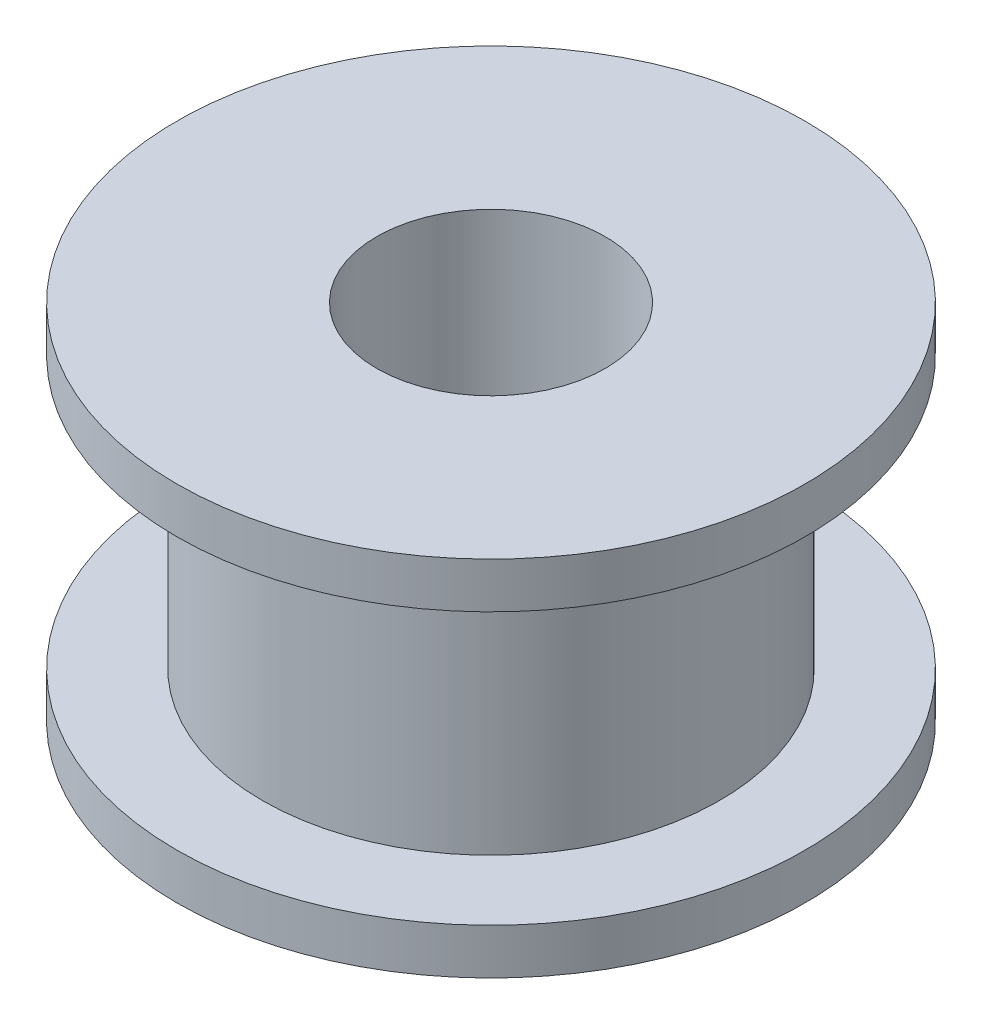
ISO-10303-21;
HEADER;
FILE_DESCRIPTION(('STEP AP214'),'2;1');
FILE_NAME('part.step','',(''),(''),'','','');
FILE_SCHEMA(('AUTOMOTIVE_DESIGN { 1 0 10303 214 1 1 1 1 }'));
ENDSEC;
DATA;
#1=APPLICATION_CONTEXT('core data for automotive mechanical design processes');
#2=APPLICATION_PROTOCOL_DEFINITION('international standard','automotive_design',2000,#1);
#3=PRODUCT_CONTEXT('',#1,'mechanical');
#4=PRODUCT('Part','Part','',(#3));
#5=PRODUCT_RELATED_PRODUCT_CATEGORY('part','',(#4));
#6=PRODUCT_DEFINITION_FORMATION('','',#4);
#7=PRODUCT_DEFINITION_CONTEXT('part definition',#1,'design');
#8=PRODUCT_DEFINITION('design','',#6,#7);
#9=PRODUCT_DEFINITION_SHAPE('','',#8);
#10=(LENGTH_UNIT() NAMED_UNIT(*) SI_UNIT(.MILLI.,.METRE.));
#11=(NAMED_UNIT(*) PLANE_ANGLE_UNIT() SI_UNIT($,.RADIAN.));
#12=(NAMED_UNIT(*) SI_UNIT($,.STERADIAN.) SOLID_ANGLE_UNIT());
#13=UNCERTAINTY_MEASURE_WITH_UNIT(LENGTH_MEASURE(1.E-05),#10,'distance_accuracy_value','');
#14=(GEOMETRIC_REPRESENTATION_CONTEXT(3) GLOBAL_UNCERTAINTY_ASSIGNED_CONTEXT((#13)) GLOBAL_UNIT_ASSIGNED_CONTEXT((#10,
#11,#12)) REPRESENTATION_CONTEXT('',''));
#15=CARTESIAN_POINT('',(0.,0.,0.));
#16=DIRECTION('',(0.,0.,1.));
#17=DIRECTION('',(1.,0.,0.));
#18=AXIS2_PLACEMENT_3D('',#15,#16,#17);
#19=CARTESIAN_POINT('',(0.,1.6,0.));
#20=DIRECTION('',(0.,-1.,0.));
#21=DIRECTION('',(0.,0.,-1.));
#22=AXIS2_PLACEMENT_3D('',#19,#20,#21);
#23=CYLINDRICAL_SURFACE('',#22,11.);
#24=CARTESIAN_POINT('',(0.,1.6,0.));
#25=DIRECTION('',(0.,1.,0.));
#26=DIRECTION('',(0.,0.,1.));
#27=AXIS2_PLACEMENT_3D('',#24,#25,#26);
#28=CIRCLE('',#27,11.);
#29=CARTESIAN_POINT('',(0.,1.6,11.));
#30=VERTEX_POINT('',#29);
#31=EDGE_CURVE('E44',#30,#30,#28,.T.);
#32=ORIENTED_EDGE('',*,*,#31,.F.);
#33=EDGE_LOOP('',(#32));
#34=FACE_BOUND('',#33,.T.);
#35=CARTESIAN_POINT('',(0.,0.,0.));
#36=DIRECTION('',(0.,1.,0.));
#37=DIRECTION('',(0.,0.,1.));
#38=AXIS2_PLACEMENT_3D('',#35,#36,#37);
#39=CIRCLE('',#38,11.);
#40=CARTESIAN_POINT('',(0.,0.,11.));
#41=VERTEX_POINT('',#40);
#42=EDGE_CURVE('E49',#41,#41,#39,.T.);
#43=ORIENTED_EDGE('',*,*,#42,.T.);
#44=EDGE_LOOP('',(#43));
#45=FACE_BOUND('',#44,.T.);
#46=ADVANCED_FACE('F37',(#34,#45),#23,.T.);
#47=CARTESIAN_POINT('',(0.,1.6,0.));
#48=DIRECTION('',(0.,1.,0.));
#49=DIRECTION('',(0.,0.,1.));
#50=AXIS2_PLACEMENT_3D('',#47,#48,#49);
#51=PLANE('',#50);
#52=CARTESIAN_POINT('',(0.,1.6,0.));
#53=DIRECTION('',(0.,1.,0.));
#54=DIRECTION('',(0.,0.,1.));
#55=AXIS2_PLACEMENT_3D('',#52,#53,#54);
#56=CIRCLE('',#55,8.);
#57=CARTESIAN_POINT('',(0.,1.6,8.));
#58=VERTEX_POINT('',#57);
#59=EDGE_CURVE('E10',#58,#58,#56,.T.);
#60=ORIENTED_EDGE('',*,*,#59,.F.);
#61=EDGE_LOOP('',(#60));
#62=FACE_BOUND('',#61,.T.);
#63=ORIENTED_EDGE('',*,*,#31,.T.);
#64=EDGE_LOOP('',(#63));
#65=FACE_BOUND('',#64,.T.);
#66=ADVANCED_FACE('F95',(#62,#65),#51,.T.);
#67=CARTESIAN_POINT('',(0.,0.,0.));
#68=DIRECTION('',(0.,1.,0.));
#69=DIRECTION('',(0.,0.,1.));
#70=AXIS2_PLACEMENT_3D('',#67,#68,#69);
#71=PLANE('',#70);
#72=CARTESIAN_POINT('',(0.,0.,0.));
#73=DIRECTION('',(0.,1.,0.));
#74=DIRECTION('',(0.,0.,1.));
#75=AXIS2_PLACEMENT_3D('',#72,#73,#74);
#76=CIRCLE('',#75,4.);
#77=CARTESIAN_POINT('',(0.,0.,4.));
#78=VERTEX_POINT('',#77);
#79=EDGE_CURVE('E68',#78,#78,#76,.T.);
#80=ORIENTED_EDGE('',*,*,#79,.T.);
#81=EDGE_LOOP('',(#80));
#82=FACE_BOUND('',#81,.T.);
#83=ORIENTED_EDGE('',*,*,#42,.F.);
#84=EDGE_LOOP('',(#83));
#85=FACE_BOUND('',#84,.T.);
#86=ADVANCED_FACE('F100',(#82,#85),#71,.F.);
#87=CARTESIAN_POINT('',(0.,11.1,0.));
#88=DIRECTION('',(0.,-1.,0.));
#89=DIRECTION('',(0.,0.,-1.));
#90=AXIS2_PLACEMENT_3D('',#87,#88,#89);
#91=CYLINDRICAL_SURFACE('',#90,8.);
#92=CARTESIAN_POINT('',(0.,11.1,0.));
#93=DIRECTION('',(0.,1.,0.));
#94=DIRECTION('',(0.,0.,1.));
#95=AXIS2_PLACEMENT_3D('',#92,#93,#94);
#96=CIRCLE('',#95,8.);
#97=CARTESIAN_POINT('',(0.,11.1,8.));
#98=VERTEX_POINT('',#97);
#99=EDGE_CURVE('E52',#98,#98,#96,.T.);
#100=ORIENTED_EDGE('',*,*,#99,.F.);
#101=EDGE_LOOP('',(#100));
#102=FACE_BOUND('',#101,.T.);
#103=ORIENTED_EDGE('',*,*,#59,.T.);
#104=EDGE_LOOP('',(#103));
#105=FACE_BOUND('',#104,.T.);
#106=ADVANCED_FACE('F90',(#102,#105),#91,.T.);
#107=CARTESIAN_POINT('',(0.,12.7,0.));
#108=DIRECTION('',(0.,-1.,0.));
#109=DIRECTION('',(0.,0.,-1.));
#110=AXIS2_PLACEMENT_3D('',#107,#108,#109);
#111=CYLINDRICAL_SURFACE('',#110,11.);
#112=CARTESIAN_POINT('',(0.,12.7,0.));
#113=DIRECTION('',(0.,1.,0.));
#114=DIRECTION('',(0.,0.,1.));
#115=AXIS2_PLACEMENT_3D('',#112,#113,#114);
#116=CIRCLE('',#115,11.);
#117=CARTESIAN_POINT('',(0.,12.7,11.));
#118=VERTEX_POINT('',#117);
#119=EDGE_CURVE('E58',#118,#118,#116,.T.);
#120=ORIENTED_EDGE('',*,*,#119,.F.);
#121=EDGE_LOOP('',(#120));
#122=FACE_BOUND('',#121,.T.);
#123=CARTESIAN_POINT('',(0.,11.1,0.));
#124=DIRECTION('',(0.,1.,0.));
#125=DIRECTION('',(0.,0.,1.));
#126=AXIS2_PLACEMENT_3D('',#123,#124,#125);
#127=CIRCLE('',#126,11.);
#128=CARTESIAN_POINT('',(0.,11.1,11.));
#129=VERTEX_POINT('',#128);
#130=EDGE_CURVE('E62',#129,#129,#127,.T.);
#131=ORIENTED_EDGE('',*,*,#130,.T.);
#132=EDGE_LOOP('',(#131));
#133=FACE_BOUND('',#132,.T.);
#134=ADVANCED_FACE('F81',(#122,#133),#111,.T.);
#135=CARTESIAN_POINT('',(0.,12.7,0.));
#136=DIRECTION('',(0.,1.,0.));
#137=DIRECTION('',(0.,0.,1.));
#138=AXIS2_PLACEMENT_3D('',#135,#136,#137);
#139=PLANE('',#138);
#140=CARTESIAN_POINT('',(0.,12.7,0.));
#141=DIRECTION('',(0.,1.,0.));
#142=DIRECTION('',(0.,0.,1.));
#143=AXIS2_PLACEMENT_3D('',#140,#141,#142);
#144=CIRCLE('',#143,4.);
#145=CARTESIAN_POINT('',(0.,12.7,4.));
#146=VERTEX_POINT('',#145);
#147=EDGE_CURVE('E40',#146,#146,#144,.T.);
#148=ORIENTED_EDGE('',*,*,#147,.F.);
#149=EDGE_LOOP('',(#148));
#150=FACE_BOUND('',#149,.T.);
#151=ORIENTED_EDGE('',*,*,#119,.T.);
#152=EDGE_LOOP('',(#151));
#153=FACE_BOUND('',#152,.T.);
#154=ADVANCED_FACE('F78',(#150,#153),#139,.T.);
#155=CARTESIAN_POINT('',(0.,11.1,0.));
#156=DIRECTION('',(0.,1.,0.));
#157=DIRECTION('',(0.,0.,1.));
#158=AXIS2_PLACEMENT_3D('',#155,#156,#157);
#159=PLANE('',#158);
#160=ORIENTED_EDGE('',*,*,#99,.T.);
#161=EDGE_LOOP('',(#160));
#162=FACE_BOUND('',#161,.T.);
#163=ORIENTED_EDGE('',*,*,#130,.F.);
#164=EDGE_LOOP('',(#163));
#165=FACE_BOUND('',#164,.T.);
#166=ADVANCED_FACE('F80',(#162,#165),#159,.F.);
#167=CARTESIAN_POINT('',(0.,0.,0.));
#168=DIRECTION('',(0.,1.,0.));
#169=DIRECTION('',(0.,0.,1.));
#170=AXIS2_PLACEMENT_3D('',#167,#168,#169);
#171=CYLINDRICAL_SURFACE('',#170,4.);
#172=CARTESIAN_POINT('',(0.,12.7,4.));
#173=CARTESIAN_POINT('',(0.,12.5677083333333,4.));
#174=CARTESIAN_POINT('',(0.,12.4354166666667,4.));
#175=CARTESIAN_POINT('',(0.,12.1708333333333,4.));
#176=CARTESIAN_POINT('',(0.,12.0385416666667,4.));
#177=CARTESIAN_POINT('',(0.,11.7739583333333,4.));
#178=CARTESIAN_POINT('',(0.,11.6416666666667,4.));
#179=CARTESIAN_POINT('',(0.,11.3770833333333,4.));
#180=CARTESIAN_POINT('',(0.,11.2447916666667,4.));
#181=CARTESIAN_POINT('',(0.,10.9802083333333,4.));
#182=CARTESIAN_POINT('',(0.,10.8479166666667,4.));
#183=CARTESIAN_POINT('',(0.,10.5833333333333,4.));
#184=CARTESIAN_POINT('',(0.,10.4510416666667,4.));
#185=CARTESIAN_POINT('',(0.,10.1864583333333,4.));
#186=CARTESIAN_POINT('',(0.,10.0541666666667,4.));
#187=CARTESIAN_POINT('',(0.,9.78958333333333,4.));
#188=CARTESIAN_POINT('',(0.,9.65729166666667,4.));
#189=CARTESIAN_POINT('',(0.,9.39270833333333,4.));
#190=CARTESIAN_POINT('',(0.,9.26041666666667,4.));
#191=CARTESIAN_POINT('',(0.,8.99583333333334,4.));
#192=CARTESIAN_POINT('',(0.,8.86354166666667,4.));
#193=CARTESIAN_POINT('',(0.,8.59895833333333,4.));
#194=CARTESIAN_POINT('',(0.,8.46666666666667,4.));
#195=CARTESIAN_POINT('',(0.,8.20208333333333,4.));
#196=CARTESIAN_POINT('',(0.,8.06979166666667,4.));
#197=CARTESIAN_POINT('',(0.,7.80520833333333,4.));
#198=CARTESIAN_POINT('',(0.,7.67291666666667,4.));
#199=CARTESIAN_POINT('',(0.,7.40833333333333,4.));
#200=CARTESIAN_POINT('',(0.,7.27604166666667,4.));
#201=CARTESIAN_POINT('',(0.,7.01145833333333,4.));
#202=CARTESIAN_POINT('',(0.,6.87916666666667,4.));
#203=CARTESIAN_POINT('',(0.,6.61458333333333,4.));
#204=CARTESIAN_POINT('',(0.,6.48229166666667,4.));
#205=CARTESIAN_POINT('',(0.,6.21770833333333,4.));
#206=CARTESIAN_POINT('',(0.,6.08541666666667,4.));
#207=CARTESIAN_POINT('',(0.,5.82083333333333,4.));
#208=CARTESIAN_POINT('',(0.,5.68854166666667,4.));
#209=CARTESIAN_POINT('',(0.,5.42395833333333,4.));
#210=CARTESIAN_POINT('',(0.,5.29166666666667,4.));
#211=CARTESIAN_POINT('',(0.,5.02708333333333,4.));
#212=CARTESIAN_POINT('',(0.,4.89479166666667,4.));
#213=CARTESIAN_POINT('',(0.,4.63020833333333,4.));
#214=CARTESIAN_POINT('',(0.,4.49791666666667,4.));
#215=CARTESIAN_POINT('',(0.,4.23333333333333,4.));
#216=CARTESIAN_POINT('',(0.,4.10104166666667,4.));
#217=CARTESIAN_POINT('',(0.,3.83645833333333,4.));
#218=CARTESIAN_POINT('',(0.,3.70416666666667,4.));
#219=CARTESIAN_POINT('',(0.,3.43958333333333,4.));
#220=CARTESIAN_POINT('',(0.,3.30729166666667,4.));
#221=CARTESIAN_POINT('',(0.,3.04270833333333,4.));
#222=CARTESIAN_POINT('',(0.,2.91041666666667,4.));
#223=CARTESIAN_POINT('',(0.,2.64583333333333,4.));
#224=CARTESIAN_POINT('',(0.,2.51354166666667,4.));
#225=CARTESIAN_POINT('',(0.,2.24895833333333,4.));
#226=CARTESIAN_POINT('',(0.,2.11666666666667,4.));
#227=CARTESIAN_POINT('',(0.,1.85208333333333,4.));
#228=CARTESIAN_POINT('',(0.,1.71979166666667,4.));
#229=CARTESIAN_POINT('',(0.,1.45520833333333,4.));
#230=CARTESIAN_POINT('',(0.,1.32291666666667,4.));
#231=CARTESIAN_POINT('',(0.,1.05833333333333,4.));
#232=CARTESIAN_POINT('',(0.,0.926041666666666,4.));
#233=CARTESIAN_POINT('',(0.,0.661458333333333,4.));
#234=CARTESIAN_POINT('',(0.,0.529166666666666,4.));
#235=CARTESIAN_POINT('',(0.,0.264583333333333,4.));
#236=CARTESIAN_POINT('',(0.,0.132291666666666,4.));
#237=CARTESIAN_POINT('',(0.,0.,4.));
#238=B_SPLINE_CURVE_WITH_KNOTS('',3,(#172,#173,#174,#175,#176,#177,#178,#179,#180,#181,#182,
#183,#184,#185,#186,#187,#188,#189,#190,#191,#192,#193,#194,#195,#196,#197,#198,#199,#200,#201,
#202,#203,#204,#205,#206,#207,#208,#209,#210,#211,#212,#213,#214,#215,#216,#217,#218,#219,#220,
#221,#222,#223,#224,#225,#226,#227,#228,#229,#230,#231,#232,#233,#234,#235,#236,#237),
.UNSPECIFIED.,.F.,.F.,(4,2,2,2,2,2,2,2,2,2,2,2,2,2,2,2,2,2,2,2,2,2,2,2,2,2,2,2,2,2,2,2,4),(0.,
0.396875,0.793749999999999,1.190625,1.5875,1.984375,2.38125,2.778125,3.175,3.571875,3.96875,
4.365625,4.7625,5.159375,5.55625,5.953125,6.35,6.746875,7.14375,7.540625,7.9375,8.334375,
8.73125,9.128125,9.525,9.921875,10.31875,10.715625,11.1125,11.509375,11.90625,12.303125,12.7),.UNSPECIFIED.);
#239=EDGE_CURVE('BSEAM75',#146,#78,#238,.T.);
#240=ORIENTED_EDGE('',*,*,#147,.T.);
#241=ORIENTED_EDGE('',*,*,#79,.F.);
#242=ORIENTED_EDGE('',*,*,#239,.T.);
#243=ORIENTED_EDGE('',*,*,#239,.F.);
#244=EDGE_LOOP('',(#240,#242,#241,#243));
#245=FACE_BOUND('',#244,.T.);
#246=ADVANCED_FACE('F75',(#245),#171,.F.);
#247=CLOSED_SHELL('',(#46,#66,#86,#106,#134,#154,#166,#246));
#248=MANIFOLD_SOLID_BREP('B2',#247);
#249=ADVANCED_BREP_SHAPE_REPRESENTATION('',(#18,#248),#14);
#250=SHAPE_DEFINITION_REPRESENTATION(#9,#249);
ENDSEC;
END-ISO-10303-21;
